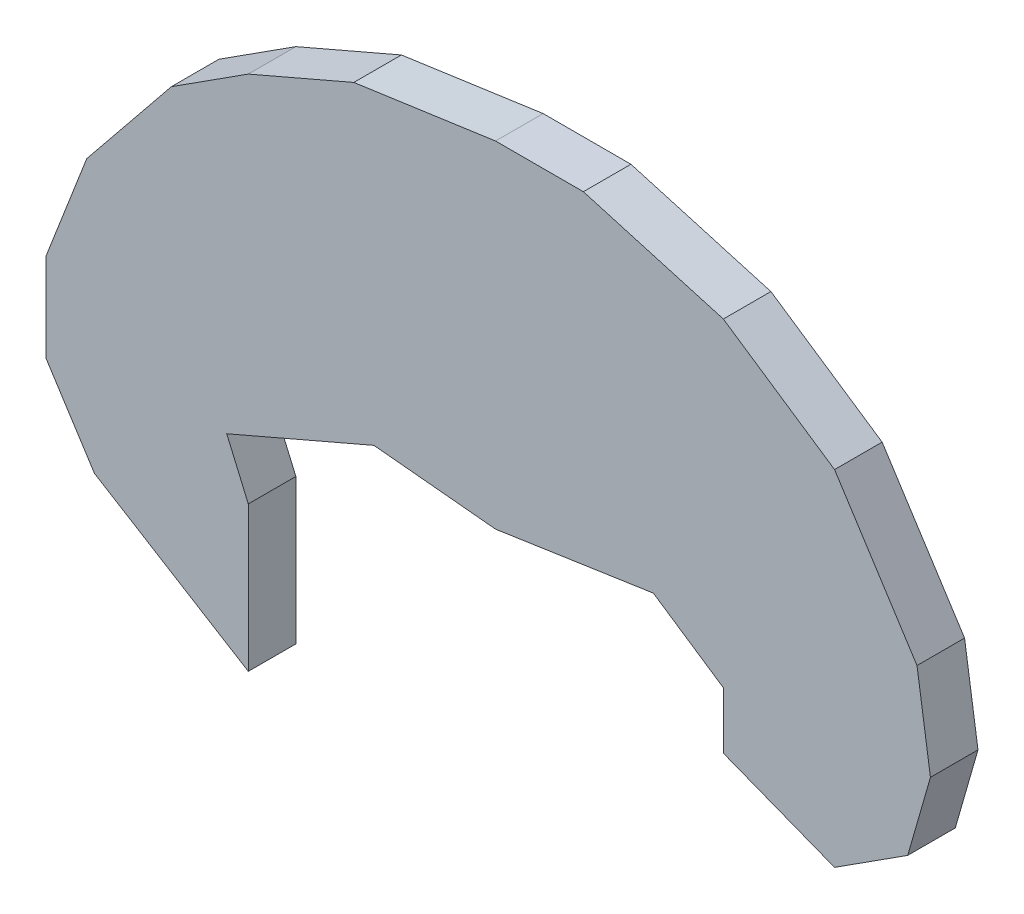
ISO-10303-21;
HEADER;
FILE_DESCRIPTION(('STEP AP214'),'2;1');
FILE_NAME('part.step','',(''),(''),'','','');
FILE_SCHEMA(('AUTOMOTIVE_DESIGN { 1 0 10303 214 1 1 1 1 }'));
ENDSEC;
DATA;
#1=APPLICATION_CONTEXT('core data for automotive mechanical design processes');
#2=APPLICATION_PROTOCOL_DEFINITION('international standard','automotive_design',2000,#1);
#3=PRODUCT_CONTEXT('',#1,'mechanical');
#4=PRODUCT('Part','Part','',(#3));
#5=PRODUCT_RELATED_PRODUCT_CATEGORY('part','',(#4));
#6=PRODUCT_DEFINITION_FORMATION('','',#4);
#7=PRODUCT_DEFINITION_CONTEXT('part definition',#1,'design');
#8=PRODUCT_DEFINITION('design','',#6,#7);
#9=PRODUCT_DEFINITION_SHAPE('','',#8);
#10=(LENGTH_UNIT() NAMED_UNIT(*) SI_UNIT(.MILLI.,.METRE.));
#11=(NAMED_UNIT(*) PLANE_ANGLE_UNIT() SI_UNIT($,.RADIAN.));
#12=(NAMED_UNIT(*) SI_UNIT($,.STERADIAN.) SOLID_ANGLE_UNIT());
#13=UNCERTAINTY_MEASURE_WITH_UNIT(LENGTH_MEASURE(1.E-05),#10,'distance_accuracy_value','');
#14=(GEOMETRIC_REPRESENTATION_CONTEXT(3) GLOBAL_UNCERTAINTY_ASSIGNED_CONTEXT((#13)) GLOBAL_UNIT_ASSIGNED_CONTEXT((#10,
#11,#12)) REPRESENTATION_CONTEXT('',''));
#15=CARTESIAN_POINT('',(0.,0.,0.));
#16=DIRECTION('',(0.,0.,1.));
#17=DIRECTION('',(1.,0.,0.));
#18=AXIS2_PLACEMENT_3D('',#15,#16,#17);
#19=CARTESIAN_POINT('',(-36.315548636837,52.9383469485903,10.));
#20=DIRECTION('',(0.140626866545685,-0.990062666908283,0.));
#21=DIRECTION('',(0.990062666908283,0.140626866545685,0.));
#22=AXIS2_PLACEMENT_3D('',#19,#20,#21);
#23=PLANE('',#22);
#24=DIRECTION('',(-0.990062666908283,-0.140626866545685,0.));
#25=VECTOR('',#24,1.);
#26=CARTESIAN_POINT('',(-36.315548636837,52.9383469485903,0.));
#27=LINE('',#26,#25);
#28=CARTESIAN_POINT('',(-6.51430029843394,57.171267058654,0.));
#29=VERTEX_POINT('',#28);
#30=CARTESIAN_POINT('',(-36.315548636837,52.9383469485903,0.));
#31=VERTEX_POINT('',#30);
#32=EDGE_CURVE('E222',#29,#31,#27,.T.);
#33=ORIENTED_EDGE('',*,*,#32,.T.);
#34=DIRECTION('',(0.,0.,-1.));
#35=VECTOR('',#34,1.);
#36=CARTESIAN_POINT('',(-36.315548636837,52.9383469485903,10.));
#37=LINE('',#36,#35);
#38=CARTESIAN_POINT('',(-36.315548636837,52.9383469485903,10.));
#39=VERTEX_POINT('',#38);
#40=EDGE_CURVE('E11',#39,#31,#37,.T.);
#41=ORIENTED_EDGE('',*,*,#40,.F.);
#42=DIRECTION('',(-0.990062666908283,-0.140626866545685,0.));
#43=VECTOR('',#42,1.);
#44=CARTESIAN_POINT('',(-36.315548636837,52.9383469485903,10.));
#45=LINE('',#44,#43);
#46=CARTESIAN_POINT('',(-6.51430029843394,57.171267058654,10.));
#47=VERTEX_POINT('',#46);
#48=EDGE_CURVE('E267',#47,#39,#45,.T.);
#49=ORIENTED_EDGE('',*,*,#48,.F.);
#50=DIRECTION('',(0.,0.,-1.));
#51=VECTOR('',#50,1.);
#52=CARTESIAN_POINT('',(-6.51430029843394,57.171267058654,10.));
#53=LINE('',#52,#51);
#54=EDGE_CURVE('E218',#47,#29,#53,.T.);
#55=ORIENTED_EDGE('',*,*,#54,.T.);
#56=EDGE_LOOP('',(#33,#41,#49,#55));
#57=FACE_BOUND('',#56,.T.);
#58=ADVANCED_FACE('F36',(#57),#23,.F.);
#59=CARTESIAN_POINT('',(-58.5003140763111,43.3648484783413,10.));
#60=DIRECTION('',(0.396216713029166,-0.918157021601623,0.));
#61=DIRECTION('',(0.918157021601623,0.396216713029166,0.));
#62=AXIS2_PLACEMENT_3D('',#59,#60,#61);
#63=PLANE('',#62);
#64=DIRECTION('',(-0.918157021601623,-0.396216713029166,0.));
#65=VECTOR('',#64,1.);
#66=CARTESIAN_POINT('',(-58.5003140763111,43.3648484783413,0.));
#67=LINE('',#66,#65);
#68=CARTESIAN_POINT('',(-58.5003140763111,43.3648484783413,0.));
#69=VERTEX_POINT('',#68);
#70=EDGE_CURVE('E225',#31,#69,#67,.T.);
#71=ORIENTED_EDGE('',*,*,#70,.T.);
#72=DIRECTION('',(0.,0.,-1.));
#73=VECTOR('',#72,1.);
#74=CARTESIAN_POINT('',(-58.5003140763111,43.3648484783413,10.));
#75=LINE('',#74,#73);
#76=CARTESIAN_POINT('',(-58.5003140763111,43.3648484783413,10.));
#77=VERTEX_POINT('',#76);
#78=EDGE_CURVE('E44',#77,#69,#75,.T.);
#79=ORIENTED_EDGE('',*,*,#78,.F.);
#80=DIRECTION('',(-0.918157021601623,-0.396216713029166,0.));
#81=VECTOR('',#80,1.);
#82=CARTESIAN_POINT('',(-58.5003140763111,43.3648484783413,10.));
#83=LINE('',#82,#81);
#84=EDGE_CURVE('E140',#39,#77,#83,.T.);
#85=ORIENTED_EDGE('',*,*,#84,.F.);
#86=ORIENTED_EDGE('',*,*,#40,.T.);
#87=EDGE_LOOP('',(#71,#79,#85,#86));
#88=FACE_BOUND('',#87,.T.);
#89=ADVANCED_FACE('F400',(#88),#63,.F.);
#90=CARTESIAN_POINT('',(-74.6764455739994,32.9831521440041,10.));
#91=DIRECTION('',(0.540122585807693,-0.841586354630593,0.));
#92=DIRECTION('',(0.841586354630593,0.540122585807693,0.));
#93=AXIS2_PLACEMENT_3D('',#90,#91,#92);
#94=PLANE('',#93);
#95=DIRECTION('',(-0.841586354630593,-0.540122585807693,0.));
#96=VECTOR('',#95,1.);
#97=CARTESIAN_POINT('',(-74.6764455739994,32.9831521440041,0.));
#98=LINE('',#97,#96);
#99=CARTESIAN_POINT('',(-74.6764455739994,32.9831521440041,0.));
#100=VERTEX_POINT('',#99);
#101=EDGE_CURVE('E227',#69,#100,#98,.T.);
#102=ORIENTED_EDGE('',*,*,#101,.T.);
#103=DIRECTION('',(0.,0.,-1.));
#104=VECTOR('',#103,1.);
#105=CARTESIAN_POINT('',(-74.6764455739994,32.9831521440041,10.));
#106=LINE('',#105,#104);
#107=CARTESIAN_POINT('',(-74.6764455739994,32.9831521440041,10.));
#108=VERTEX_POINT('',#107);
#109=EDGE_CURVE('E319',#108,#100,#106,.T.);
#110=ORIENTED_EDGE('',*,*,#109,.F.);
#111=DIRECTION('',(-0.841586354630593,-0.540122585807693,0.));
#112=VECTOR('',#111,1.);
#113=CARTESIAN_POINT('',(-74.6764455739994,32.9831521440041,10.));
#114=LINE('',#113,#112);
#115=EDGE_CURVE('E327',#77,#108,#114,.T.);
#116=ORIENTED_EDGE('',*,*,#115,.F.);
#117=ORIENTED_EDGE('',*,*,#78,.T.);
#118=EDGE_LOOP('',(#102,#110,#116,#117));
#119=FACE_BOUND('',#118,.T.);
#120=ADVANCED_FACE('F325',(#119),#94,.F.);
#121=CARTESIAN_POINT('',(-92.464649531538,10.9894636116209,10.));
#122=DIRECTION('',(0.777525052836135,-0.628851963670437,0.));
#123=DIRECTION('',(0.628851963670437,0.777525052836135,0.));
#124=AXIS2_PLACEMENT_3D('',#121,#122,#123);
#125=PLANE('',#124);
#126=DIRECTION('',(-0.628851963670437,-0.777525052836135,0.));
#127=VECTOR('',#126,1.);
#128=CARTESIAN_POINT('',(-92.464649531538,10.9894636116209,0.));
#129=LINE('',#128,#127);
#130=CARTESIAN_POINT('',(-92.464649531538,10.9894636116209,0.));
#131=VERTEX_POINT('',#130);
#132=EDGE_CURVE('E229',#100,#131,#129,.T.);
#133=ORIENTED_EDGE('',*,*,#132,.T.);
#134=DIRECTION('',(0.,0.,-1.));
#135=VECTOR('',#134,1.);
#136=CARTESIAN_POINT('',(-92.464649531538,10.9894636116209,10.));
#137=LINE('',#136,#135);
#138=CARTESIAN_POINT('',(-92.464649531538,10.9894636116209,10.));
#139=VERTEX_POINT('',#138);
#140=EDGE_CURVE('E316',#139,#131,#137,.T.);
#141=ORIENTED_EDGE('',*,*,#140,.F.);
#142=DIRECTION('',(-0.628851963670437,-0.777525052836135,0.));
#143=VECTOR('',#142,1.);
#144=CARTESIAN_POINT('',(-92.464649531538,10.9894636116209,10.));
#145=LINE('',#144,#143);
#146=EDGE_CURVE('E345',#108,#139,#145,.T.);
#147=ORIENTED_EDGE('',*,*,#146,.F.);
#148=ORIENTED_EDGE('',*,*,#109,.T.);
#149=EDGE_LOOP('',(#133,#141,#147,#148));
#150=FACE_BOUND('',#149,.T.);
#151=ADVANCED_FACE('F336',(#150),#125,.F.);
#152=CARTESIAN_POINT('',(-101.031994192736,-11.0324650852387,10.));
#153=DIRECTION('',(0.931958041853694,-0.362566143240414,0.));
#154=DIRECTION('',(0.362566143240414,0.931958041853694,0.));
#155=AXIS2_PLACEMENT_3D('',#152,#153,#154);
#156=PLANE('',#155);
#157=DIRECTION('',(-0.362566143240414,-0.931958041853694,0.));
#158=VECTOR('',#157,1.);
#159=CARTESIAN_POINT('',(-101.031994192736,-11.0324650852387,0.));
#160=LINE('',#159,#158);
#161=CARTESIAN_POINT('',(-101.031994192736,-11.0324650852387,0.));
#162=VERTEX_POINT('',#161);
#163=EDGE_CURVE('E231',#131,#162,#160,.T.);
#164=ORIENTED_EDGE('',*,*,#163,.T.);
#165=DIRECTION('',(0.,0.,-1.));
#166=VECTOR('',#165,1.);
#167=CARTESIAN_POINT('',(-101.031994192736,-11.0324650852387,10.));
#168=LINE('',#167,#166);
#169=CARTESIAN_POINT('',(-101.031994192736,-11.0324650852387,10.));
#170=VERTEX_POINT('',#169);
#171=EDGE_CURVE('E313',#170,#162,#168,.T.);
#172=ORIENTED_EDGE('',*,*,#171,.F.);
#173=DIRECTION('',(-0.362566143240414,-0.931958041853694,0.));
#174=VECTOR('',#173,1.);
#175=CARTESIAN_POINT('',(-101.031994192736,-11.0324650852387,10.));
#176=LINE('',#175,#174);
#177=EDGE_CURVE('E342',#139,#170,#176,.T.);
#178=ORIENTED_EDGE('',*,*,#177,.F.);
#179=ORIENTED_EDGE('',*,*,#140,.T.);
#180=EDGE_LOOP('',(#164,#172,#178,#179));
#181=FACE_BOUND('',#180,.T.);
#182=ADVANCED_FACE('F340',(#181),#156,.F.);
#183=CARTESIAN_POINT('',(-101.031994192736,-29.6434126289609,10.));
#184=DIRECTION('',(1.,0.,0.));
#185=DIRECTION('',(0.,0.,-1.));
#186=AXIS2_PLACEMENT_3D('',#183,#184,#185);
#187=PLANE('',#186);
#188=DIRECTION('',(0.,-1.,0.));
#189=VECTOR('',#188,1.);
#190=CARTESIAN_POINT('',(-101.031994192736,-29.6434126289609,0.));
#191=LINE('',#190,#189);
#192=CARTESIAN_POINT('',(-101.031994192736,-29.6434126289609,0.));
#193=VERTEX_POINT('',#192);
#194=EDGE_CURVE('E233',#162,#193,#191,.T.);
#195=ORIENTED_EDGE('',*,*,#194,.T.);
#196=DIRECTION('',(0.,0.,-1.));
#197=VECTOR('',#196,1.);
#198=CARTESIAN_POINT('',(-101.031994192736,-29.6434126289609,10.));
#199=LINE('',#198,#197);
#200=CARTESIAN_POINT('',(-101.031994192736,-29.6434126289609,10.));
#201=VERTEX_POINT('',#200);
#202=EDGE_CURVE('E310',#201,#193,#199,.T.);
#203=ORIENTED_EDGE('',*,*,#202,.F.);
#204=DIRECTION('',(0.,-1.,0.));
#205=VECTOR('',#204,1.);
#206=CARTESIAN_POINT('',(-101.031994192736,-29.6434126289609,10.));
#207=LINE('',#206,#205);
#208=EDGE_CURVE('E344',#170,#201,#207,.T.);
#209=ORIENTED_EDGE('',*,*,#208,.F.);
#210=ORIENTED_EDGE('',*,*,#171,.T.);
#211=EDGE_LOOP('',(#195,#203,#209,#210));
#212=FACE_BOUND('',#211,.T.);
#213=ADVANCED_FACE('F413',(#212),#187,.F.);
#214=CARTESIAN_POINT('',(-90.8525770716876,-45.5043648873386,10.));
#215=DIRECTION('',(0.841586354630593,0.540122585807694,0.));
#216=DIRECTION('',(-0.540122585807694,0.841586354630593,0.));
#217=AXIS2_PLACEMENT_3D('',#214,#215,#216);
#218=PLANE('',#217);
#219=DIRECTION('',(0.540122585807694,-0.841586354630593,0.));
#220=VECTOR('',#219,1.);
#221=CARTESIAN_POINT('',(-90.8525770716876,-45.5043648873386,0.));
#222=LINE('',#221,#220);
#223=CARTESIAN_POINT('',(-90.8525770716876,-45.5043648873386,0.));
#224=VERTEX_POINT('',#223);
#225=EDGE_CURVE('E235',#193,#224,#222,.T.);
#226=ORIENTED_EDGE('',*,*,#225,.T.);
#227=DIRECTION('',(0.,0.,-1.));
#228=VECTOR('',#227,1.);
#229=CARTESIAN_POINT('',(-90.8525770716876,-45.5043648873386,10.));
#230=LINE('',#229,#228);
#231=CARTESIAN_POINT('',(-90.8525770716876,-45.5043648873386,10.));
#232=VERTEX_POINT('',#231);
#233=EDGE_CURVE('E307',#232,#224,#230,.T.);
#234=ORIENTED_EDGE('',*,*,#233,.F.);
#235=DIRECTION('',(0.540122585807694,-0.841586354630593,0.));
#236=VECTOR('',#235,1.);
#237=CARTESIAN_POINT('',(-90.8525770716876,-45.5043648873386,10.));
#238=LINE('',#237,#236);
#239=EDGE_CURVE('E347',#201,#232,#238,.T.);
#240=ORIENTED_EDGE('',*,*,#239,.F.);
#241=ORIENTED_EDGE('',*,*,#202,.T.);
#242=EDGE_LOOP('',(#226,#234,#240,#241));
#243=FACE_BOUND('',#242,.T.);
#244=ADVANCED_FACE('F416',(#243),#218,.F.);
#245=CARTESIAN_POINT('',(-58.5003140763111,-65.3878466460468,10.));
#246=DIRECTION('',(0.523608305917802,0.851959119895955,0.));
#247=DIRECTION('',(-0.851959119895955,0.523608305917802,0.));
#248=AXIS2_PLACEMENT_3D('',#245,#246,#247);
#249=PLANE('',#248);
#250=DIRECTION('',(0.851959119895955,-0.523608305917802,0.));
#251=VECTOR('',#250,1.);
#252=CARTESIAN_POINT('',(-58.5003140763111,-65.3878466460468,0.));
#253=LINE('',#252,#251);
#254=CARTESIAN_POINT('',(-58.5003140763111,-65.3878466460468,0.));
#255=VERTEX_POINT('',#254);
#256=EDGE_CURVE('E237',#224,#255,#253,.T.);
#257=ORIENTED_EDGE('',*,*,#256,.T.);
#258=DIRECTION('',(0.,0.,-1.));
#259=VECTOR('',#258,1.);
#260=CARTESIAN_POINT('',(-58.5003140763111,-65.3878466460468,10.));
#261=LINE('',#260,#259);
#262=CARTESIAN_POINT('',(-58.5003140763111,-65.3878466460468,10.));
#263=VERTEX_POINT('',#262);
#264=EDGE_CURVE('E304',#263,#255,#261,.T.);
#265=ORIENTED_EDGE('',*,*,#264,.F.);
#266=DIRECTION('',(0.851959119895955,-0.523608305917802,0.));
#267=VECTOR('',#266,1.);
#268=CARTESIAN_POINT('',(-58.5003140763111,-65.3878466460468,10.));
#269=LINE('',#268,#267);
#270=EDGE_CURVE('E353',#232,#263,#269,.T.);
#271=ORIENTED_EDGE('',*,*,#270,.F.);
#272=ORIENTED_EDGE('',*,*,#233,.T.);
#273=EDGE_LOOP('',(#257,#265,#271,#272));
#274=FACE_BOUND('',#273,.T.);
#275=ADVANCED_FACE('F420',(#274),#249,.F.);
#276=CARTESIAN_POINT('',(-58.5003140763111,-34.8989919830541,10.));
#277=DIRECTION('',(-1.,0.,0.));
#278=DIRECTION('',(0.,0.,1.));
#279=AXIS2_PLACEMENT_3D('',#276,#277,#278);
#280=PLANE('',#279);
#281=DIRECTION('',(0.,1.,0.));
#282=VECTOR('',#281,1.);
#283=CARTESIAN_POINT('',(-58.5003140763111,-34.8989919830541,0.));
#284=LINE('',#283,#282);
#285=CARTESIAN_POINT('',(-58.5003140763111,-34.8989919830541,0.));
#286=VERTEX_POINT('',#285);
#287=EDGE_CURVE('E240',#255,#286,#284,.T.);
#288=ORIENTED_EDGE('',*,*,#287,.T.);
#289=DIRECTION('',(0.,0.,-1.));
#290=VECTOR('',#289,1.);
#291=CARTESIAN_POINT('',(-58.5003140763111,-34.8989919830541,10.));
#292=LINE('',#291,#290);
#293=CARTESIAN_POINT('',(-58.5003140763111,-34.8989919830541,10.));
#294=VERTEX_POINT('',#293);
#295=EDGE_CURVE('E301',#294,#286,#292,.T.);
#296=ORIENTED_EDGE('',*,*,#295,.F.);
#297=DIRECTION('',(0.,1.,0.));
#298=VECTOR('',#297,1.);
#299=CARTESIAN_POINT('',(-58.5003140763111,-56.1097377916231,10.));
#300=LINE('',#299,#298);
#301=EDGE_CURVE('E355',#263,#294,#300,.T.);
#302=ORIENTED_EDGE('',*,*,#301,.F.);
#303=ORIENTED_EDGE('',*,*,#264,.T.);
#304=EDGE_LOOP('',(#288,#296,#302,#303));
#305=FACE_BOUND('',#304,.T.);
#306=ADVANCED_FACE('F424',(#305),#280,.F.);
#307=CARTESIAN_POINT('',(-63.0362449198402,-24.3878332748676,10.));
#308=DIRECTION('',(-0.918157021601623,-0.396216713029166,0.));
#309=DIRECTION('',(0.396216713029166,-0.918157021601623,0.));
#310=AXIS2_PLACEMENT_3D('',#307,#308,#309);
#311=PLANE('',#310);
#312=DIRECTION('',(-0.396216713029166,0.918157021601623,0.));
#313=VECTOR('',#312,1.);
#314=CARTESIAN_POINT('',(-63.0362449198402,-24.3878332748676,0.));
#315=LINE('',#314,#313);
#316=CARTESIAN_POINT('',(-63.0362449198402,-24.3878332748676,0.));
#317=VERTEX_POINT('',#316);
#318=EDGE_CURVE('E242',#286,#317,#315,.T.);
#319=ORIENTED_EDGE('',*,*,#318,.T.);
#320=DIRECTION('',(0.,0.,-1.));
#321=VECTOR('',#320,1.);
#322=CARTESIAN_POINT('',(-63.0362449198402,-24.3878332748676,10.));
#323=LINE('',#322,#321);
#324=CARTESIAN_POINT('',(-63.0362449198402,-24.3878332748676,10.));
#325=VERTEX_POINT('',#324);
#326=EDGE_CURVE('E298',#325,#317,#323,.T.);
#327=ORIENTED_EDGE('',*,*,#326,.F.);
#328=DIRECTION('',(-0.396216713029166,0.918157021601623,0.));
#329=VECTOR('',#328,1.);
#330=CARTESIAN_POINT('',(-63.0362449198402,-24.3878332748676,10.));
#331=LINE('',#330,#329);
#332=EDGE_CURVE('E357',#294,#325,#331,.T.);
#333=ORIENTED_EDGE('',*,*,#332,.F.);
#334=ORIENTED_EDGE('',*,*,#295,.T.);
#335=EDGE_LOOP('',(#319,#327,#333,#334));
#336=FACE_BOUND('',#335,.T.);
#337=ADVANCED_FACE('F428',(#336),#311,.F.);
#338=CARTESIAN_POINT('',(-32.0877142896341,-11.0324650852387,10.));
#339=DIRECTION('',(-0.396216713029166,0.918157021601623,0.));
#340=DIRECTION('',(-0.918157021601623,-0.396216713029166,0.));
#341=AXIS2_PLACEMENT_3D('',#338,#339,#340);
#342=PLANE('',#341);
#343=DIRECTION('',(0.918157021601623,0.396216713029166,0.));
#344=VECTOR('',#343,1.);
#345=CARTESIAN_POINT('',(-32.0877142896341,-11.0324650852387,0.));
#346=LINE('',#345,#344);
#347=CARTESIAN_POINT('',(-32.0877142896341,-11.0324650852387,0.));
#348=VERTEX_POINT('',#347);
#349=EDGE_CURVE('E244',#317,#348,#346,.T.);
#350=ORIENTED_EDGE('',*,*,#349,.T.);
#351=DIRECTION('',(0.,0.,-1.));
#352=VECTOR('',#351,1.);
#353=CARTESIAN_POINT('',(-32.0877142896341,-11.0324650852387,10.));
#354=LINE('',#353,#352);
#355=CARTESIAN_POINT('',(-32.0877142896341,-11.0324650852387,10.));
#356=VERTEX_POINT('',#355);
#357=EDGE_CURVE('E295',#356,#348,#354,.T.);
#358=ORIENTED_EDGE('',*,*,#357,.F.);
#359=DIRECTION('',(0.918157021601623,0.396216713029166,0.));
#360=VECTOR('',#359,1.);
#361=CARTESIAN_POINT('',(-32.0877142896341,-11.0324650852387,10.));
#362=LINE('',#361,#360);
#363=EDGE_CURVE('E359',#325,#356,#362,.T.);
#364=ORIENTED_EDGE('',*,*,#363,.F.);
#365=ORIENTED_EDGE('',*,*,#326,.T.);
#366=EDGE_LOOP('',(#350,#358,#364,#365));
#367=FACE_BOUND('',#366,.T.);
#368=ADVANCED_FACE('F432',(#367),#342,.F.);
#369=CARTESIAN_POINT('',(-6.51430029843394,-13.5029920778942,10.));
#370=DIRECTION('',(0.0961576293546469,0.995366118730638,0.));
#371=DIRECTION('',(-0.995366118730638,0.0961576293546469,0.));
#372=AXIS2_PLACEMENT_3D('',#369,#370,#371);
#373=PLANE('',#372);
#374=DIRECTION('',(0.995366118730638,-0.0961576293546469,0.));
#375=VECTOR('',#374,1.);
#376=CARTESIAN_POINT('',(-6.51430029843394,-13.5029920778942,0.));
#377=LINE('',#376,#375);
#378=CARTESIAN_POINT('',(-6.51430029843394,-13.5029920778942,0.));
#379=VERTEX_POINT('',#378);
#380=EDGE_CURVE('E246',#348,#379,#377,.T.);
#381=ORIENTED_EDGE('',*,*,#380,.T.);
#382=DIRECTION('',(0.,0.,-1.));
#383=VECTOR('',#382,1.);
#384=CARTESIAN_POINT('',(-6.51430029843394,-13.5029920778942,10.));
#385=LINE('',#384,#383);
#386=CARTESIAN_POINT('',(-6.51430029843394,-13.5029920778942,10.));
#387=VERTEX_POINT('',#386);
#388=EDGE_CURVE('E292',#387,#379,#385,.T.);
#389=ORIENTED_EDGE('',*,*,#388,.F.);
#390=DIRECTION('',(0.995366118730638,-0.0961576293546469,0.));
#391=VECTOR('',#390,1.);
#392=CARTESIAN_POINT('',(-6.51430029843394,-13.5029920778942,10.));
#393=LINE('',#392,#391);
#394=EDGE_CURVE('E361',#356,#387,#393,.T.);
#395=ORIENTED_EDGE('',*,*,#394,.F.);
#396=ORIENTED_EDGE('',*,*,#357,.T.);
#397=EDGE_LOOP('',(#381,#389,#395,#396));
#398=FACE_BOUND('',#397,.T.);
#399=ADVANCED_FACE('F436',(#398),#373,.F.);
#400=CARTESIAN_POINT('',(26.6613478886533,-8.56193809258323,10.));
#401=DIRECTION('',(-0.147311303088784,0.989090177881817,0.));
#402=DIRECTION('',(-0.989090177881817,-0.147311303088784,0.));
#403=AXIS2_PLACEMENT_3D('',#400,#401,#402);
#404=PLANE('',#403);
#405=DIRECTION('',(0.989090177881817,0.147311303088784,0.));
#406=VECTOR('',#405,1.);
#407=CARTESIAN_POINT('',(26.6613478886533,-8.56193809258323,0.));
#408=LINE('',#407,#406);
#409=CARTESIAN_POINT('',(26.6613478886533,-8.56193809258323,0.));
#410=VERTEX_POINT('',#409);
#411=EDGE_CURVE('E248',#379,#410,#408,.T.);
#412=ORIENTED_EDGE('',*,*,#411,.T.);
#413=DIRECTION('',(0.,0.,-1.));
#414=VECTOR('',#413,1.);
#415=CARTESIAN_POINT('',(26.6613478886533,-8.56193809258323,10.));
#416=LINE('',#415,#414);
#417=CARTESIAN_POINT('',(26.6613478886533,-8.56193809258323,10.));
#418=VERTEX_POINT('',#417);
#419=EDGE_CURVE('E289',#418,#410,#416,.T.);
#420=ORIENTED_EDGE('',*,*,#419,.F.);
#421=DIRECTION('',(0.989090177881817,0.147311303088784,0.));
#422=VECTOR('',#421,1.);
#423=CARTESIAN_POINT('',(26.6613478886533,-8.56193809258323,10.));
#424=LINE('',#423,#422);
#425=EDGE_CURVE('E363',#387,#418,#424,.T.);
#426=ORIENTED_EDGE('',*,*,#425,.F.);
#427=ORIENTED_EDGE('',*,*,#388,.T.);
#428=EDGE_LOOP('',(#412,#420,#426,#427));
#429=FACE_BOUND('',#428,.T.);
#430=ADVANCED_FACE('F440',(#429),#404,.F.);
#431=CARTESIAN_POINT('',(41.3757844617319,-18.4248756506251,10.));
#432=DIRECTION('',(0.556782048869563,0.830658624259456,0.));
#433=DIRECTION('',(-0.830658624259456,0.556782048869563,0.));
#434=AXIS2_PLACEMENT_3D('',#431,#432,#433);
#435=PLANE('',#434);
#436=DIRECTION('',(0.830658624259456,-0.556782048869563,0.));
#437=VECTOR('',#436,1.);
#438=CARTESIAN_POINT('',(41.3757844617319,-18.4248756506251,0.));
#439=LINE('',#438,#437);
#440=CARTESIAN_POINT('',(41.3757844617319,-18.4248756506251,0.));
#441=VERTEX_POINT('',#440);
#442=EDGE_CURVE('E250',#410,#441,#439,.T.);
#443=ORIENTED_EDGE('',*,*,#442,.T.);
#444=DIRECTION('',(0.,0.,-1.));
#445=VECTOR('',#444,1.);
#446=CARTESIAN_POINT('',(41.3757844617319,-18.4248756506251,10.));
#447=LINE('',#446,#445);
#448=CARTESIAN_POINT('',(41.3757844617319,-18.4248756506251,10.));
#449=VERTEX_POINT('',#448);
#450=EDGE_CURVE('E286',#449,#441,#447,.T.);
#451=ORIENTED_EDGE('',*,*,#450,.F.);
#452=DIRECTION('',(0.830658624259456,-0.556782048869563,0.));
#453=VECTOR('',#452,1.);
#454=CARTESIAN_POINT('',(41.3757844617319,-18.4248756506251,10.));
#455=LINE('',#454,#453);
#456=EDGE_CURVE('E365',#418,#449,#455,.T.);
#457=ORIENTED_EDGE('',*,*,#456,.F.);
#458=ORIENTED_EDGE('',*,*,#419,.T.);
#459=EDGE_LOOP('',(#443,#451,#457,#458));
#460=FACE_BOUND('',#459,.T.);
#461=ADVANCED_FACE('F444',(#460),#435,.F.);
#462=CARTESIAN_POINT('',(41.3757844617319,-30.3507908991101,10.));
#463=DIRECTION('',(1.,0.,0.));
#464=DIRECTION('',(0.,0.,-1.));
#465=AXIS2_PLACEMENT_3D('',#462,#463,#464);
#466=PLANE('',#465);
#467=DIRECTION('',(0.,-1.,0.));
#468=VECTOR('',#467,1.);
#469=CARTESIAN_POINT('',(41.3757844617319,-30.3507908991101,0.));
#470=LINE('',#469,#468);
#471=CARTESIAN_POINT('',(41.3757844617319,-30.3507908991101,0.));
#472=VERTEX_POINT('',#471);
#473=EDGE_CURVE('E252',#441,#472,#470,.T.);
#474=ORIENTED_EDGE('',*,*,#473,.T.);
#475=DIRECTION('',(0.,0.,-1.));
#476=VECTOR('',#475,1.);
#477=CARTESIAN_POINT('',(41.3757844617319,-30.3507908991101,10.));
#478=LINE('',#477,#476);
#479=CARTESIAN_POINT('',(41.3757844617319,-30.3507908991101,10.));
#480=VERTEX_POINT('',#479);
#481=EDGE_CURVE('E283',#480,#472,#478,.T.);
#482=ORIENTED_EDGE('',*,*,#481,.F.);
#483=DIRECTION('',(0.,-1.,0.));
#484=VECTOR('',#483,1.);
#485=CARTESIAN_POINT('',(41.3757844617319,-30.3507908991101,10.));
#486=LINE('',#485,#484);
#487=EDGE_CURVE('E367',#449,#480,#486,.T.);
#488=ORIENTED_EDGE('',*,*,#487,.F.);
#489=ORIENTED_EDGE('',*,*,#450,.T.);
#490=EDGE_LOOP('',(#474,#482,#488,#489));
#491=FACE_BOUND('',#490,.T.);
#492=ADVANCED_FACE('F448',(#491),#466,.F.);
#493=CARTESIAN_POINT('',(64.7576288792269,-39.4471930669981,10.));
#494=DIRECTION('',(0.362566143240414,0.931958041853694,0.));
#495=DIRECTION('',(-0.931958041853694,0.362566143240414,0.));
#496=AXIS2_PLACEMENT_3D('',#493,#494,#495);
#497=PLANE('',#496);
#498=DIRECTION('',(0.931958041853694,-0.362566143240414,0.));
#499=VECTOR('',#498,1.);
#500=CARTESIAN_POINT('',(64.7576288792269,-39.4471930669981,0.));
#501=LINE('',#500,#499);
#502=CARTESIAN_POINT('',(64.7576288792269,-39.4471930669981,0.));
#503=VERTEX_POINT('',#502);
#504=EDGE_CURVE('E254',#472,#503,#501,.T.);
#505=ORIENTED_EDGE('',*,*,#504,.T.);
#506=DIRECTION('',(0.,0.,-1.));
#507=VECTOR('',#506,1.);
#508=CARTESIAN_POINT('',(64.7576288792269,-39.4471930669981,10.));
#509=LINE('',#508,#507);
#510=CARTESIAN_POINT('',(64.7576288792269,-39.4471930669981,10.));
#511=VERTEX_POINT('',#510);
#512=EDGE_CURVE('E280',#511,#503,#509,.T.);
#513=ORIENTED_EDGE('',*,*,#512,.F.);
#514=DIRECTION('',(0.931958041853694,-0.362566143240414,0.));
#515=VECTOR('',#514,1.);
#516=CARTESIAN_POINT('',(64.7576288792269,-39.4471930669981,10.));
#517=LINE('',#516,#515);
#518=EDGE_CURVE('E369',#480,#511,#517,.T.);
#519=ORIENTED_EDGE('',*,*,#518,.F.);
#520=ORIENTED_EDGE('',*,*,#481,.T.);
#521=EDGE_LOOP('',(#505,#513,#519,#520));
#522=FACE_BOUND('',#521,.T.);
#523=ADVANCED_FACE('F452',(#522),#497,.F.);
#524=CARTESIAN_POINT('',(80.1386010279433,-29.575822882001,10.));
#525=DIRECTION('',(-0.540122585807694,0.841586354630593,0.));
#526=DIRECTION('',(-0.841586354630593,-0.540122585807694,0.));
#527=AXIS2_PLACEMENT_3D('',#524,#525,#526);
#528=PLANE('',#527);
#529=DIRECTION('',(0.841586354630593,0.540122585807694,0.));
#530=VECTOR('',#529,1.);
#531=CARTESIAN_POINT('',(80.1386010279433,-29.575822882001,0.));
#532=LINE('',#531,#530);
#533=CARTESIAN_POINT('',(80.1386010279433,-29.575822882001,0.));
#534=VERTEX_POINT('',#533);
#535=EDGE_CURVE('E256',#503,#534,#532,.T.);
#536=ORIENTED_EDGE('',*,*,#535,.T.);
#537=DIRECTION('',(0.,0.,-1.));
#538=VECTOR('',#537,1.);
#539=CARTESIAN_POINT('',(80.1386010279433,-29.575822882001,10.));
#540=LINE('',#539,#538);
#541=CARTESIAN_POINT('',(80.1386010279433,-29.575822882001,10.));
#542=VERTEX_POINT('',#541);
#543=EDGE_CURVE('E277',#542,#534,#540,.T.);
#544=ORIENTED_EDGE('',*,*,#543,.F.);
#545=DIRECTION('',(0.841586354630593,0.540122585807694,0.));
#546=VECTOR('',#545,1.);
#547=CARTESIAN_POINT('',(80.1386010279433,-29.575822882001,10.));
#548=LINE('',#547,#546);
#549=EDGE_CURVE('E371',#511,#542,#548,.T.);
#550=ORIENTED_EDGE('',*,*,#549,.F.);
#551=ORIENTED_EDGE('',*,*,#512,.T.);
#552=EDGE_LOOP('',(#536,#544,#550,#551));
#553=FACE_BOUND('',#552,.T.);
#554=ADVANCED_FACE('F456',(#553),#528,.F.);
#555=CARTESIAN_POINT('',(84.9143913081019,-12.9742661938307,10.));
#556=DIRECTION('',(-0.961025593124995,0.276459417200341,0.));
#557=DIRECTION('',(-0.276459417200341,-0.961025593124995,0.));
#558=AXIS2_PLACEMENT_3D('',#555,#556,#557);
#559=PLANE('',#558);
#560=DIRECTION('',(0.276459417200341,0.961025593124995,0.));
#561=VECTOR('',#560,1.);
#562=CARTESIAN_POINT('',(84.9143913081019,-12.9742661938307,0.));
#563=LINE('',#562,#561);
#564=CARTESIAN_POINT('',(84.9143913081019,-12.9742661938307,0.));
#565=VERTEX_POINT('',#564);
#566=EDGE_CURVE('E258',#534,#565,#563,.T.);
#567=ORIENTED_EDGE('',*,*,#566,.T.);
#568=DIRECTION('',(0.,0.,-1.));
#569=VECTOR('',#568,1.);
#570=CARTESIAN_POINT('',(84.9143913081019,-12.9742661938307,10.));
#571=LINE('',#570,#569);
#572=CARTESIAN_POINT('',(84.9143913081019,-12.9742661938307,10.));
#573=VERTEX_POINT('',#572);
#574=EDGE_CURVE('E274',#573,#565,#571,.T.);
#575=ORIENTED_EDGE('',*,*,#574,.F.);
#576=DIRECTION('',(0.276459417200341,0.961025593124995,0.));
#577=VECTOR('',#576,1.);
#578=CARTESIAN_POINT('',(84.9143913081019,-12.9742661938307,10.));
#579=LINE('',#578,#577);
#580=EDGE_CURVE('E373',#542,#573,#579,.T.);
#581=ORIENTED_EDGE('',*,*,#580,.F.);
#582=ORIENTED_EDGE('',*,*,#543,.T.);
#583=EDGE_LOOP('',(#567,#575,#581,#582));
#584=FACE_BOUND('',#583,.T.);
#585=ADVANCED_FACE('F460',(#584),#559,.F.);
#586=CARTESIAN_POINT('',(82.0924445680593,5.97309048931171,10.));
#587=DIRECTION('',(-0.989090177881817,-0.147311303088784,0.));
#588=DIRECTION('',(0.147311303088784,-0.989090177881817,0.));
#589=AXIS2_PLACEMENT_3D('',#586,#587,#588);
#590=PLANE('',#589);
#591=DIRECTION('',(-0.147311303088784,0.989090177881817,0.));
#592=VECTOR('',#591,1.);
#593=CARTESIAN_POINT('',(82.0924445680593,5.97309048931171,0.));
#594=LINE('',#593,#592);
#595=CARTESIAN_POINT('',(82.0924445680593,5.97309048931171,0.));
#596=VERTEX_POINT('',#595);
#597=EDGE_CURVE('E260',#565,#596,#594,.T.);
#598=ORIENTED_EDGE('',*,*,#597,.T.);
#599=DIRECTION('',(0.,0.,-1.));
#600=VECTOR('',#599,1.);
#601=CARTESIAN_POINT('',(82.0924445680593,5.97309048931171,10.));
#602=LINE('',#601,#600);
#603=CARTESIAN_POINT('',(82.0924445680593,5.97309048931171,10.));
#604=VERTEX_POINT('',#603);
#605=EDGE_CURVE('E271',#604,#596,#602,.T.);
#606=ORIENTED_EDGE('',*,*,#605,.F.);
#607=DIRECTION('',(-0.147311303088784,0.989090177881817,0.));
#608=VECTOR('',#607,1.);
#609=CARTESIAN_POINT('',(82.0924445680593,5.97309048931171,10.));
#610=LINE('',#609,#608);
#611=EDGE_CURVE('E375',#573,#604,#610,.T.);
#612=ORIENTED_EDGE('',*,*,#611,.F.);
#613=ORIENTED_EDGE('',*,*,#574,.T.);
#614=EDGE_LOOP('',(#598,#606,#612,#613));
#615=FACE_BOUND('',#614,.T.);
#616=ADVANCED_FACE('F381',(#615),#590,.F.);
#617=CARTESIAN_POINT('',(64.7576288792269,32.9831521440041,10.));
#618=DIRECTION('',(-0.841586354630593,-0.540122585807694,0.));
#619=DIRECTION('',(0.540122585807694,-0.841586354630593,0.));
#620=AXIS2_PLACEMENT_3D('',#617,#618,#619);
#621=PLANE('',#620);
#622=DIRECTION('',(-0.540122585807694,0.841586354630593,0.));
#623=VECTOR('',#622,1.);
#624=CARTESIAN_POINT('',(64.7576288792269,32.9831521440041,0.));
#625=LINE('',#624,#623);
#626=CARTESIAN_POINT('',(64.7576288792269,32.9831521440041,0.));
#627=VERTEX_POINT('',#626);
#628=EDGE_CURVE('E262',#596,#627,#625,.T.);
#629=ORIENTED_EDGE('',*,*,#628,.T.);
#630=DIRECTION('',(0.,0.,-1.));
#631=VECTOR('',#630,1.);
#632=CARTESIAN_POINT('',(64.7576288792269,32.9831521440041,10.));
#633=LINE('',#632,#631);
#634=CARTESIAN_POINT('',(64.7576288792269,32.9831521440041,10.));
#635=VERTEX_POINT('',#634);
#636=EDGE_CURVE('E213',#635,#627,#633,.T.);
#637=ORIENTED_EDGE('',*,*,#636,.F.);
#638=DIRECTION('',(-0.540122585807694,0.841586354630593,0.));
#639=VECTOR('',#638,1.);
#640=CARTESIAN_POINT('',(64.7576288792269,32.9831521440041,10.));
#641=LINE('',#640,#639);
#642=EDGE_CURVE('E204',#604,#635,#641,.T.);
#643=ORIENTED_EDGE('',*,*,#642,.F.);
#644=ORIENTED_EDGE('',*,*,#605,.T.);
#645=EDGE_LOOP('',(#629,#637,#643,#644));
#646=FACE_BOUND('',#645,.T.);
#647=ADVANCED_FACE('F385',(#646),#621,.F.);
#648=CARTESIAN_POINT('',(41.375784461732,48.7054268385266,10.));
#649=DIRECTION('',(-0.557997589719759,-0.829842569326821,0.));
#650=DIRECTION('',(0.829842569326821,-0.557997589719759,0.));
#651=AXIS2_PLACEMENT_3D('',#648,#649,#650);
#652=PLANE('',#651);
#653=DIRECTION('',(-0.829842569326821,0.557997589719759,0.));
#654=VECTOR('',#653,1.);
#655=CARTESIAN_POINT('',(41.375784461732,48.7054268385266,0.));
#656=LINE('',#655,#654);
#657=CARTESIAN_POINT('',(41.375784461732,48.7054268385266,0.));
#658=VERTEX_POINT('',#657);
#659=EDGE_CURVE('E212',#627,#658,#656,.T.);
#660=ORIENTED_EDGE('',*,*,#659,.T.);
#661=DIRECTION('',(0.,0.,-1.));
#662=VECTOR('',#661,1.);
#663=CARTESIAN_POINT('',(41.375784461732,48.7054268385266,10.));
#664=LINE('',#663,#662);
#665=CARTESIAN_POINT('',(41.375784461732,48.7054268385266,10.));
#666=VERTEX_POINT('',#665);
#667=EDGE_CURVE('E209',#666,#658,#664,.T.);
#668=ORIENTED_EDGE('',*,*,#667,.F.);
#669=DIRECTION('',(-0.829842569326821,0.557997589719759,0.));
#670=VECTOR('',#669,1.);
#671=CARTESIAN_POINT('',(41.375784461732,48.7054268385266,10.));
#672=LINE('',#671,#670);
#673=EDGE_CURVE('E198',#635,#666,#672,.T.);
#674=ORIENTED_EDGE('',*,*,#673,.F.);
#675=ORIENTED_EDGE('',*,*,#636,.T.);
#676=EDGE_LOOP('',(#660,#668,#674,#675));
#677=FACE_BOUND('',#676,.T.);
#678=ADVANCED_FACE('F210',(#677),#652,.F.);
#679=CARTESIAN_POINT('',(11.9469113155746,57.171267058654,10.));
#680=DIRECTION('',(-0.276459417200341,-0.961025593124995,0.));
#681=DIRECTION('',(0.961025593124995,-0.276459417200341,0.));
#682=AXIS2_PLACEMENT_3D('',#679,#680,#681);
#683=PLANE('',#682);
#684=DIRECTION('',(-0.961025593124995,0.276459417200341,0.));
#685=VECTOR('',#684,1.);
#686=CARTESIAN_POINT('',(11.9469113155746,57.171267058654,0.));
#687=LINE('',#686,#685);
#688=CARTESIAN_POINT('',(11.9469113155746,57.171267058654,0.));
#689=VERTEX_POINT('',#688);
#690=EDGE_CURVE('E126',#658,#689,#687,.T.);
#691=ORIENTED_EDGE('',*,*,#690,.T.);
#692=DIRECTION('',(0.,0.,-1.));
#693=VECTOR('',#692,1.);
#694=CARTESIAN_POINT('',(11.9469113155746,57.171267058654,10.));
#695=LINE('',#694,#693);
#696=CARTESIAN_POINT('',(11.9469113155746,57.171267058654,10.));
#697=VERTEX_POINT('',#696);
#698=EDGE_CURVE('E214',#697,#689,#695,.T.);
#699=ORIENTED_EDGE('',*,*,#698,.F.);
#700=DIRECTION('',(-0.961025593124995,0.276459417200341,0.));
#701=VECTOR('',#700,1.);
#702=CARTESIAN_POINT('',(11.9469113155746,57.171267058654,10.));
#703=LINE('',#702,#701);
#704=EDGE_CURVE('E202',#666,#697,#703,.T.);
#705=ORIENTED_EDGE('',*,*,#704,.F.);
#706=ORIENTED_EDGE('',*,*,#667,.T.);
#707=EDGE_LOOP('',(#691,#699,#705,#706));
#708=FACE_BOUND('',#707,.T.);
#709=ADVANCED_FACE('F216',(#708),#683,.F.);
#710=CARTESIAN_POINT('',(-6.51430029843394,57.171267058654,10.));
#711=DIRECTION('',(0.,-1.,0.));
#712=DIRECTION('',(0.,0.,-1.));
#713=AXIS2_PLACEMENT_3D('',#710,#711,#712);
#714=PLANE('',#713);
#715=DIRECTION('',(-1.,0.,0.));
#716=VECTOR('',#715,1.);
#717=CARTESIAN_POINT('',(-6.51430029843394,57.171267058654,0.));
#718=LINE('',#717,#716);
#719=EDGE_CURVE('E132',#689,#29,#718,.T.);
#720=ORIENTED_EDGE('',*,*,#719,.T.);
#721=ORIENTED_EDGE('',*,*,#54,.F.);
#722=DIRECTION('',(-1.,0.,0.));
#723=VECTOR('',#722,1.);
#724=CARTESIAN_POINT('',(-6.51430029843394,57.171267058654,10.));
#725=LINE('',#724,#723);
#726=EDGE_CURVE('E52',#697,#47,#725,.T.);
#727=ORIENTED_EDGE('',*,*,#726,.F.);
#728=ORIENTED_EDGE('',*,*,#698,.T.);
#729=EDGE_LOOP('',(#720,#721,#727,#728));
#730=FACE_BOUND('',#729,.T.);
#731=ADVANCED_FACE('F389',(#730),#714,.F.);
#732=CARTESIAN_POINT('',(0.,0.,10.));
#733=DIRECTION('',(0.,0.,-1.));
#734=DIRECTION('',(-1.,0.,0.));
#735=AXIS2_PLACEMENT_3D('',#732,#733,#734);
#736=PLANE('',#735);
#737=ORIENTED_EDGE('',*,*,#48,.T.);
#738=ORIENTED_EDGE('',*,*,#84,.T.);
#739=ORIENTED_EDGE('',*,*,#115,.T.);
#740=ORIENTED_EDGE('',*,*,#146,.T.);
#741=ORIENTED_EDGE('',*,*,#177,.T.);
#742=ORIENTED_EDGE('',*,*,#208,.T.);
#743=ORIENTED_EDGE('',*,*,#239,.T.);
#744=ORIENTED_EDGE('',*,*,#270,.T.);
#745=ORIENTED_EDGE('',*,*,#301,.T.);
#746=ORIENTED_EDGE('',*,*,#332,.T.);
#747=ORIENTED_EDGE('',*,*,#363,.T.);
#748=ORIENTED_EDGE('',*,*,#394,.T.);
#749=ORIENTED_EDGE('',*,*,#425,.T.);
#750=ORIENTED_EDGE('',*,*,#456,.T.);
#751=ORIENTED_EDGE('',*,*,#487,.T.);
#752=ORIENTED_EDGE('',*,*,#518,.T.);
#753=ORIENTED_EDGE('',*,*,#549,.T.);
#754=ORIENTED_EDGE('',*,*,#580,.T.);
#755=ORIENTED_EDGE('',*,*,#611,.T.);
#756=ORIENTED_EDGE('',*,*,#642,.T.);
#757=ORIENTED_EDGE('',*,*,#673,.T.);
#758=ORIENTED_EDGE('',*,*,#704,.T.);
#759=ORIENTED_EDGE('',*,*,#726,.T.);
#760=EDGE_LOOP('',(#737,#738,#739,#740,#741,#742,#743,#744,#745,#746,#747,#748,#749,#750,#751,
#752,#753,#754,#755,#756,#757,#758,#759));
#761=FACE_BOUND('',#760,.T.);
#762=ADVANCED_FACE('F200',(#761),#736,.F.);
#763=CARTESIAN_POINT('',(0.,0.,0.));
#764=DIRECTION('',(0.,0.,-1.));
#765=DIRECTION('',(-1.,0.,0.));
#766=AXIS2_PLACEMENT_3D('',#763,#764,#765);
#767=PLANE('',#766);
#768=ORIENTED_EDGE('',*,*,#32,.F.);
#769=ORIENTED_EDGE('',*,*,#719,.F.);
#770=ORIENTED_EDGE('',*,*,#690,.F.);
#771=ORIENTED_EDGE('',*,*,#659,.F.);
#772=ORIENTED_EDGE('',*,*,#628,.F.);
#773=ORIENTED_EDGE('',*,*,#597,.F.);
#774=ORIENTED_EDGE('',*,*,#566,.F.);
#775=ORIENTED_EDGE('',*,*,#535,.F.);
#776=ORIENTED_EDGE('',*,*,#504,.F.);
#777=ORIENTED_EDGE('',*,*,#473,.F.);
#778=ORIENTED_EDGE('',*,*,#442,.F.);
#779=ORIENTED_EDGE('',*,*,#411,.F.);
#780=ORIENTED_EDGE('',*,*,#380,.F.);
#781=ORIENTED_EDGE('',*,*,#349,.F.);
#782=ORIENTED_EDGE('',*,*,#318,.F.);
#783=ORIENTED_EDGE('',*,*,#287,.F.);
#784=ORIENTED_EDGE('',*,*,#256,.F.);
#785=ORIENTED_EDGE('',*,*,#225,.F.);
#786=ORIENTED_EDGE('',*,*,#194,.F.);
#787=ORIENTED_EDGE('',*,*,#163,.F.);
#788=ORIENTED_EDGE('',*,*,#132,.F.);
#789=ORIENTED_EDGE('',*,*,#101,.F.);
#790=ORIENTED_EDGE('',*,*,#70,.F.);
#791=EDGE_LOOP('',(#768,#769,#770,#771,#772,#773,#774,#775,#776,#777,#778,#779,#780,#781,#782,
#783,#784,#785,#786,#787,#788,#789,#790));
#792=FACE_BOUND('',#791,.T.);
#793=ADVANCED_FACE('F331',(#792),#767,.T.);
#794=CLOSED_SHELL('',(#58,#89,#120,#151,#182,#213,#244,#275,#306,#337,#368,#399,#430,#461,#492,
#523,#554,#585,#616,#647,#678,#709,#731,#762,#793));
#795=MANIFOLD_SOLID_BREP('B2',#794);
#796=ADVANCED_BREP_SHAPE_REPRESENTATION('',(#18,#795),#14);
#797=SHAPE_DEFINITION_REPRESENTATION(#9,#796);
ENDSEC;
END-ISO-10303-21;
